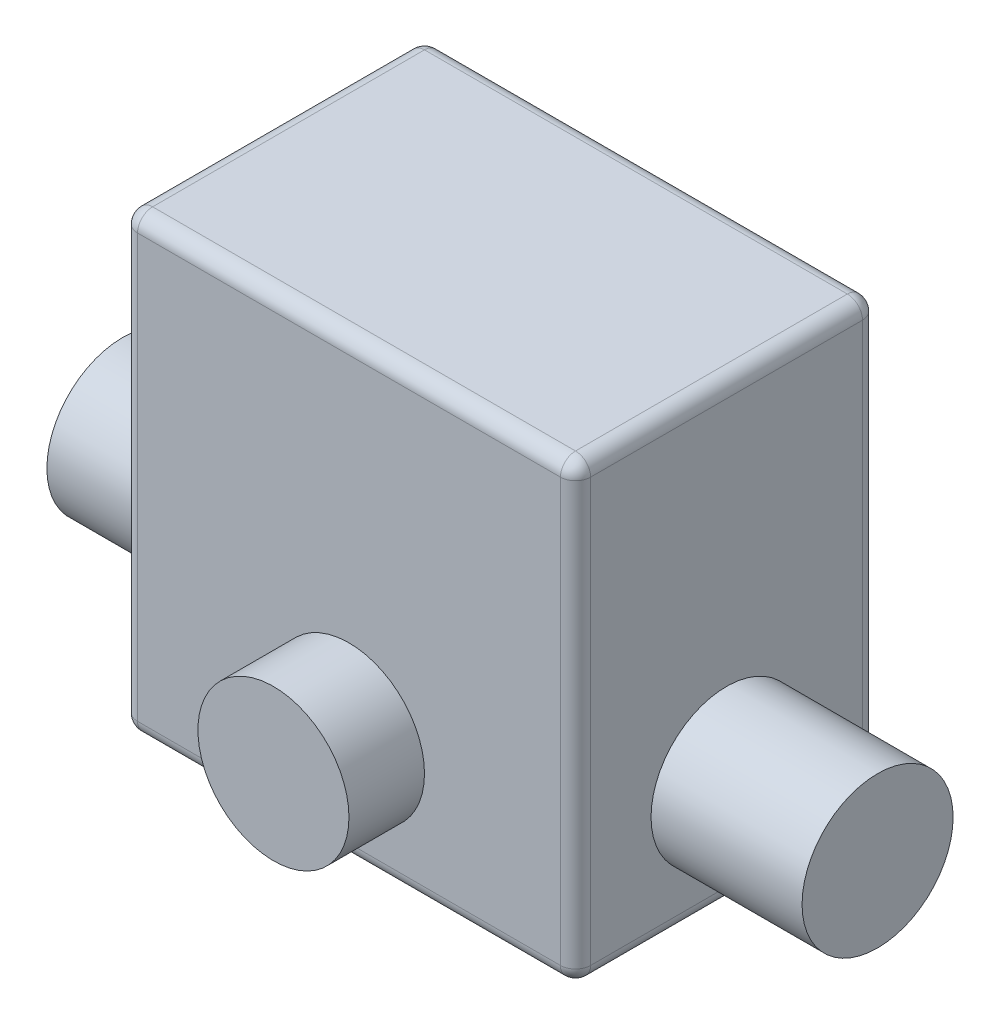
ISO-10303-21;
HEADER;
FILE_DESCRIPTION(('STEP AP214'),'2;1');
FILE_NAME('part.step','',(''),(''),'','','');
FILE_SCHEMA(('AUTOMOTIVE_DESIGN { 1 0 10303 214 1 1 1 1 }'));
ENDSEC;
DATA;
#1=APPLICATION_CONTEXT('core data for automotive mechanical design processes');
#2=APPLICATION_PROTOCOL_DEFINITION('international standard','automotive_design',2000,#1);
#3=PRODUCT_CONTEXT('',#1,'mechanical');
#4=PRODUCT('Part','Part','',(#3));
#5=PRODUCT_RELATED_PRODUCT_CATEGORY('part','',(#4));
#6=PRODUCT_DEFINITION_FORMATION('','',#4);
#7=PRODUCT_DEFINITION_CONTEXT('part definition',#1,'design');
#8=PRODUCT_DEFINITION('design','',#6,#7);
#9=PRODUCT_DEFINITION_SHAPE('','',#8);
#10=(LENGTH_UNIT() NAMED_UNIT(*) SI_UNIT(.MILLI.,.METRE.));
#11=(NAMED_UNIT(*) PLANE_ANGLE_UNIT() SI_UNIT($,.RADIAN.));
#12=(NAMED_UNIT(*) SI_UNIT($,.STERADIAN.) SOLID_ANGLE_UNIT());
#13=UNCERTAINTY_MEASURE_WITH_UNIT(LENGTH_MEASURE(1.E-05),#10,'distance_accuracy_value','');
#14=(GEOMETRIC_REPRESENTATION_CONTEXT(3) GLOBAL_UNCERTAINTY_ASSIGNED_CONTEXT((#13)) GLOBAL_UNIT_ASSIGNED_CONTEXT((#10,
#11,#12)) REPRESENTATION_CONTEXT('',''));
#15=CARTESIAN_POINT('',(0.,0.,0.));
#16=DIRECTION('',(0.,0.,1.));
#17=DIRECTION('',(1.,0.,0.));
#18=AXIS2_PLACEMENT_3D('',#15,#16,#17);
#19=CARTESIAN_POINT('',(0.,0.,2.));
#20=DIRECTION('',(0.,0.,1.));
#21=DIRECTION('',(1.,0.,0.));
#22=AXIS2_PLACEMENT_3D('',#19,#20,#21);
#23=PLANE('',#22);
#24=DIRECTION('',(0.,1.,0.));
#25=VECTOR('',#24,1.);
#26=CARTESIAN_POINT('',(2.9,3.,2.));
#27=LINE('',#26,#25);
#28=CARTESIAN_POINT('',(2.9,0.1,2.));
#29=VERTEX_POINT('',#28);
#30=CARTESIAN_POINT('',(2.9,2.9,2.));
#31=VERTEX_POINT('',#30);
#32=EDGE_CURVE('E236',#29,#31,#27,.T.);
#33=ORIENTED_EDGE('',*,*,#32,.T.);
#34=DIRECTION('',(1.,0.,0.));
#35=VECTOR('',#34,1.);
#36=CARTESIAN_POINT('',(0.,2.9,2.));
#37=LINE('',#36,#35);
#38=CARTESIAN_POINT('',(0.1,2.9,2.));
#39=VERTEX_POINT('',#38);
#40=EDGE_CURVE('E239',#31,#39,#37,.F.);
#41=ORIENTED_EDGE('',*,*,#40,.T.);
#42=DIRECTION('',(0.,1.,0.));
#43=VECTOR('',#42,1.);
#44=CARTESIAN_POINT('',(0.1,0.,2.));
#45=LINE('',#44,#43);
#46=CARTESIAN_POINT('',(0.1,0.1,2.));
#47=VERTEX_POINT('',#46);
#48=EDGE_CURVE('E234',#39,#47,#45,.F.);
#49=ORIENTED_EDGE('',*,*,#48,.T.);
#50=DIRECTION('',(1.,0.,0.));
#51=VECTOR('',#50,1.);
#52=CARTESIAN_POINT('',(3.,0.1,2.));
#53=LINE('',#52,#51);
#54=EDGE_CURVE('E232',#47,#29,#53,.T.);
#55=ORIENTED_EDGE('',*,*,#54,.T.);
#56=EDGE_LOOP('',(#33,#41,#49,#55));
#57=FACE_BOUND('',#56,.T.);
#58=CARTESIAN_POINT('',(1.5,0.75,2.));
#59=DIRECTION('',(0.,0.,1.));
#60=DIRECTION('',(1.,0.,0.));
#61=AXIS2_PLACEMENT_3D('',#58,#59,#60);
#62=CIRCLE('',#61,0.5);
#63=CARTESIAN_POINT('',(2.,0.75,2.));
#64=VERTEX_POINT('',#63);
#65=EDGE_CURVE('E616',#64,#64,#62,.T.);
#66=ORIENTED_EDGE('',*,*,#65,.F.);
#67=EDGE_LOOP('',(#66));
#68=FACE_BOUND('',#67,.T.);
#69=ADVANCED_FACE('F35',(#57,#68),#23,.T.);
#70=CARTESIAN_POINT('',(3.,0.,2.));
#71=DIRECTION('',(-1.,0.,0.));
#72=DIRECTION('',(0.,0.,1.));
#73=AXIS2_PLACEMENT_3D('',#70,#71,#72);
#74=PLANE('',#73);
#75=DIRECTION('',(0.,1.,0.));
#76=VECTOR('',#75,1.);
#77=CARTESIAN_POINT('',(3.,0.,0.1));
#78=LINE('',#77,#76);
#79=CARTESIAN_POINT('',(3.,0.1,0.1));
#80=VERTEX_POINT('',#79);
#81=CARTESIAN_POINT('',(3.,2.9,0.1));
#82=VERTEX_POINT('',#81);
#83=EDGE_CURVE('E225',#80,#82,#78,.T.);
#84=ORIENTED_EDGE('',*,*,#83,.T.);
#85=DIRECTION('',(0.,0.,-1.));
#86=VECTOR('',#85,1.);
#87=CARTESIAN_POINT('',(3.,2.9,2.));
#88=LINE('',#87,#86);
#89=CARTESIAN_POINT('',(3.,2.9,1.9));
#90=VERTEX_POINT('',#89);
#91=EDGE_CURVE('E229',#82,#90,#88,.F.);
#92=ORIENTED_EDGE('',*,*,#91,.T.);
#93=DIRECTION('',(0.,1.,0.));
#94=VECTOR('',#93,1.);
#95=CARTESIAN_POINT('',(3.,0.,1.9));
#96=LINE('',#95,#94);
#97=CARTESIAN_POINT('',(3.,0.1,1.9));
#98=VERTEX_POINT('',#97);
#99=EDGE_CURVE('E227',#90,#98,#96,.F.);
#100=ORIENTED_EDGE('',*,*,#99,.T.);
#101=DIRECTION('',(0.,0.,-1.));
#102=VECTOR('',#101,1.);
#103=CARTESIAN_POINT('',(3.,0.1,2.));
#104=LINE('',#103,#102);
#105=EDGE_CURVE('E223',#98,#80,#104,.T.);
#106=ORIENTED_EDGE('',*,*,#105,.T.);
#107=EDGE_LOOP('',(#84,#92,#100,#106));
#108=FACE_BOUND('',#107,.T.);
#109=CARTESIAN_POINT('',(3.,0.75,1.));
#110=DIRECTION('',(-1.,0.,0.));
#111=DIRECTION('',(0.,0.,1.));
#112=AXIS2_PLACEMENT_3D('',#109,#110,#111);
#113=CIRCLE('',#112,0.5);
#114=CARTESIAN_POINT('',(3.,0.75,1.5));
#115=VERTEX_POINT('',#114);
#116=EDGE_CURVE('E148',#115,#115,#113,.F.);
#117=ORIENTED_EDGE('',*,*,#116,.F.);
#118=EDGE_LOOP('',(#117));
#119=FACE_BOUND('',#118,.T.);
#120=ADVANCED_FACE('F290',(#108,#119),#74,.F.);
#121=CARTESIAN_POINT('',(0.,0.,2.));
#122=DIRECTION('',(-1.,0.,0.));
#123=DIRECTION('',(0.,0.,1.));
#124=AXIS2_PLACEMENT_3D('',#121,#122,#123);
#125=PLANE('',#124);
#126=DIRECTION('',(0.,0.,-1.));
#127=VECTOR('',#126,1.);
#128=CARTESIAN_POINT('',(0.,0.1,2.));
#129=LINE('',#128,#127);
#130=CARTESIAN_POINT('',(0.,0.1,0.1));
#131=VERTEX_POINT('',#130);
#132=CARTESIAN_POINT('',(0.,0.1,1.9));
#133=VERTEX_POINT('',#132);
#134=EDGE_CURVE('E241',#131,#133,#129,.F.);
#135=ORIENTED_EDGE('',*,*,#134,.T.);
#136=DIRECTION('',(0.,1.,0.));
#137=VECTOR('',#136,1.);
#138=CARTESIAN_POINT('',(0.,0.,1.9));
#139=LINE('',#138,#137);
#140=CARTESIAN_POINT('',(0.,2.9,1.9));
#141=VERTEX_POINT('',#140);
#142=EDGE_CURVE('E247',#133,#141,#139,.T.);
#143=ORIENTED_EDGE('',*,*,#142,.T.);
#144=DIRECTION('',(0.,0.,-1.));
#145=VECTOR('',#144,1.);
#146=CARTESIAN_POINT('',(0.,2.9,2.));
#147=LINE('',#146,#145);
#148=CARTESIAN_POINT('',(0.,2.9,0.1));
#149=VERTEX_POINT('',#148);
#150=EDGE_CURVE('E245',#141,#149,#147,.T.);
#151=ORIENTED_EDGE('',*,*,#150,.T.);
#152=DIRECTION('',(0.,1.,0.));
#153=VECTOR('',#152,1.);
#154=CARTESIAN_POINT('',(0.,0.,0.1));
#155=LINE('',#154,#153);
#156=EDGE_CURVE('E243',#149,#131,#155,.F.);
#157=ORIENTED_EDGE('',*,*,#156,.T.);
#158=EDGE_LOOP('',(#135,#143,#151,#157));
#159=FACE_BOUND('',#158,.T.);
#160=CARTESIAN_POINT('',(0.,0.75,1.));
#161=DIRECTION('',(-1.,0.,0.));
#162=DIRECTION('',(0.,0.,1.));
#163=AXIS2_PLACEMENT_3D('',#160,#161,#162);
#164=CIRCLE('',#163,0.5);
#165=CARTESIAN_POINT('',(0.,0.75,1.5));
#166=VERTEX_POINT('',#165);
#167=EDGE_CURVE('E213',#166,#166,#164,.F.);
#168=ORIENTED_EDGE('',*,*,#167,.T.);
#169=EDGE_LOOP('',(#168));
#170=FACE_BOUND('',#169,.T.);
#171=ADVANCED_FACE('F312',(#159,#170),#125,.T.);
#172=CARTESIAN_POINT('',(0.,0.,2.));
#173=DIRECTION('',(0.,1.,0.));
#174=DIRECTION('',(0.,0.,1.));
#175=AXIS2_PLACEMENT_3D('',#172,#173,#174);
#176=PLANE('',#175);
#177=DIRECTION('',(0.,0.,-1.));
#178=VECTOR('',#177,1.);
#179=CARTESIAN_POINT('',(2.9,0.,2.));
#180=LINE('',#179,#178);
#181=CARTESIAN_POINT('',(2.9,0.,0.1));
#182=VERTEX_POINT('',#181);
#183=CARTESIAN_POINT('',(2.9,0.,1.9));
#184=VERTEX_POINT('',#183);
#185=EDGE_CURVE('E258',#182,#184,#180,.F.);
#186=ORIENTED_EDGE('',*,*,#185,.T.);
#187=DIRECTION('',(1.,0.,0.));
#188=VECTOR('',#187,1.);
#189=CARTESIAN_POINT('',(0.,0.,1.9));
#190=LINE('',#189,#188);
#191=CARTESIAN_POINT('',(0.1,0.,1.9));
#192=VERTEX_POINT('',#191);
#193=EDGE_CURVE('E11',#184,#192,#190,.F.);
#194=ORIENTED_EDGE('',*,*,#193,.T.);
#195=DIRECTION('',(0.,0.,-1.));
#196=VECTOR('',#195,1.);
#197=CARTESIAN_POINT('',(0.1,0.,0.));
#198=LINE('',#197,#196);
#199=CARTESIAN_POINT('',(0.1,0.,0.1));
#200=VERTEX_POINT('',#199);
#201=EDGE_CURVE('E44',#192,#200,#198,.T.);
#202=ORIENTED_EDGE('',*,*,#201,.T.);
#203=DIRECTION('',(1.,0.,0.));
#204=VECTOR('',#203,1.);
#205=CARTESIAN_POINT('',(0.,0.,0.1));
#206=LINE('',#205,#204);
#207=EDGE_CURVE('E260',#200,#182,#206,.T.);
#208=ORIENTED_EDGE('',*,*,#207,.T.);
#209=EDGE_LOOP('',(#186,#194,#202,#208));
#210=FACE_BOUND('',#209,.T.);
#211=ADVANCED_FACE('F366',(#210),#176,.F.);
#212=CARTESIAN_POINT('',(0.,3.,2.));
#213=DIRECTION('',(0.,1.,0.));
#214=DIRECTION('',(0.,0.,1.));
#215=AXIS2_PLACEMENT_3D('',#212,#213,#214);
#216=PLANE('',#215);
#217=DIRECTION('',(1.,0.,0.));
#218=VECTOR('',#217,1.);
#219=CARTESIAN_POINT('',(0.,3.,1.9));
#220=LINE('',#219,#218);
#221=CARTESIAN_POINT('',(0.1,3.,1.9));
#222=VERTEX_POINT('',#221);
#223=CARTESIAN_POINT('',(2.9,3.,1.9));
#224=VERTEX_POINT('',#223);
#225=EDGE_CURVE('E137',#222,#224,#220,.T.);
#226=ORIENTED_EDGE('',*,*,#225,.T.);
#227=DIRECTION('',(0.,0.,-1.));
#228=VECTOR('',#227,1.);
#229=CARTESIAN_POINT('',(2.9,3.,0.));
#230=LINE('',#229,#228);
#231=CARTESIAN_POINT('',(2.9,3.,0.1));
#232=VERTEX_POINT('',#231);
#233=EDGE_CURVE('E133',#224,#232,#230,.T.);
#234=ORIENTED_EDGE('',*,*,#233,.T.);
#235=DIRECTION('',(1.,0.,0.));
#236=VECTOR('',#235,1.);
#237=CARTESIAN_POINT('',(0.,3.,0.1));
#238=LINE('',#237,#236);
#239=CARTESIAN_POINT('',(0.1,3.,0.1));
#240=VERTEX_POINT('',#239);
#241=EDGE_CURVE('E127',#232,#240,#238,.F.);
#242=ORIENTED_EDGE('',*,*,#241,.T.);
#243=DIRECTION('',(0.,0.,-1.));
#244=VECTOR('',#243,1.);
#245=CARTESIAN_POINT('',(0.1,3.,2.));
#246=LINE('',#245,#244);
#247=EDGE_CURVE('E130',#240,#222,#246,.F.);
#248=ORIENTED_EDGE('',*,*,#247,.T.);
#249=EDGE_LOOP('',(#226,#234,#242,#248));
#250=FACE_BOUND('',#249,.T.);
#251=ADVANCED_FACE('F129',(#250),#216,.T.);
#252=CARTESIAN_POINT('',(0.,0.,0.));
#253=DIRECTION('',(0.,0.,1.));
#254=DIRECTION('',(1.,0.,0.));
#255=AXIS2_PLACEMENT_3D('',#252,#253,#254);
#256=PLANE('',#255);
#257=DIRECTION('',(1.,0.,0.));
#258=VECTOR('',#257,1.);
#259=CARTESIAN_POINT('',(3.,2.9,0.));
#260=LINE('',#259,#258);
#261=CARTESIAN_POINT('',(0.1,2.9,0.));
#262=VERTEX_POINT('',#261);
#263=CARTESIAN_POINT('',(2.9,2.9,0.));
#264=VERTEX_POINT('',#263);
#265=EDGE_CURVE('E159',#262,#264,#260,.T.);
#266=ORIENTED_EDGE('',*,*,#265,.T.);
#267=DIRECTION('',(0.,1.,0.));
#268=VECTOR('',#267,1.);
#269=CARTESIAN_POINT('',(2.9,0.,0.));
#270=LINE('',#269,#268);
#271=CARTESIAN_POINT('',(2.9,0.1,0.));
#272=VERTEX_POINT('',#271);
#273=EDGE_CURVE('E255',#264,#272,#270,.F.);
#274=ORIENTED_EDGE('',*,*,#273,.T.);
#275=DIRECTION('',(1.,0.,0.));
#276=VECTOR('',#275,1.);
#277=CARTESIAN_POINT('',(0.,0.1,0.));
#278=LINE('',#277,#276);
#279=CARTESIAN_POINT('',(0.1,0.1,0.));
#280=VERTEX_POINT('',#279);
#281=EDGE_CURVE('E250',#272,#280,#278,.F.);
#282=ORIENTED_EDGE('',*,*,#281,.T.);
#283=DIRECTION('',(0.,1.,0.));
#284=VECTOR('',#283,1.);
#285=CARTESIAN_POINT('',(0.1,3.,0.));
#286=LINE('',#285,#284);
#287=EDGE_CURVE('E252',#280,#262,#286,.T.);
#288=ORIENTED_EDGE('',*,*,#287,.T.);
#289=EDGE_LOOP('',(#266,#274,#282,#288));
#290=FACE_BOUND('',#289,.T.);
#291=ADVANCED_FACE('F304',(#290),#256,.F.);
#292=CARTESIAN_POINT('',(-1.,0.75,1.));
#293=DIRECTION('',(1.,0.,0.));
#294=DIRECTION('',(0.,0.,-1.));
#295=AXIS2_PLACEMENT_3D('',#292,#293,#294);
#296=PLANE('',#295);
#297=CARTESIAN_POINT('',(-1.,0.75,1.));
#298=DIRECTION('',(1.,0.,0.));
#299=DIRECTION('',(0.,0.,-1.));
#300=AXIS2_PLACEMENT_3D('',#297,#298,#299);
#301=CIRCLE('',#300,0.5);
#302=CARTESIAN_POINT('',(-1.,0.75,0.5));
#303=VERTEX_POINT('',#302);
#304=EDGE_CURVE('E203',#303,#303,#301,.T.);
#305=ORIENTED_EDGE('',*,*,#304,.F.);
#306=EDGE_LOOP('',(#305));
#307=FACE_BOUND('',#306,.T.);
#308=ADVANCED_FACE('F363',(#307),#296,.F.);
#309=CARTESIAN_POINT('',(4.,0.75,1.));
#310=DIRECTION('',(-1.,0.,0.));
#311=DIRECTION('',(0.,0.,1.));
#312=AXIS2_PLACEMENT_3D('',#309,#310,#311);
#313=CYLINDRICAL_SURFACE('',#312,0.5);
#314=ORIENTED_EDGE('',*,*,#167,.F.);
#315=EDGE_LOOP('',(#314));
#316=FACE_BOUND('',#315,.T.);
#317=ORIENTED_EDGE('',*,*,#304,.T.);
#318=EDGE_LOOP('',(#317));
#319=FACE_BOUND('',#318,.T.);
#320=ADVANCED_FACE('F359',(#316,#319),#313,.T.);
#321=CARTESIAN_POINT('',(4.,0.75,1.));
#322=DIRECTION('',(1.,0.,0.));
#323=DIRECTION('',(0.,0.,-1.));
#324=AXIS2_PLACEMENT_3D('',#321,#322,#323);
#325=CIRCLE('',#324,0.5);
#326=CARTESIAN_POINT('',(4.,0.75,0.5));
#327=VERTEX_POINT('',#326);
#328=EDGE_CURVE('E208',#327,#327,#325,.T.);
#329=ORIENTED_EDGE('',*,*,#328,.F.);
#330=EDGE_LOOP('',(#329));
#331=FACE_BOUND('',#330,.T.);
#332=ORIENTED_EDGE('',*,*,#116,.T.);
#333=EDGE_LOOP('',(#332));
#334=FACE_BOUND('',#333,.T.);
#335=ADVANCED_FACE('F551',(#331,#334),#313,.T.);
#336=CARTESIAN_POINT('',(4.,0.75,1.));
#337=DIRECTION('',(1.,0.,0.));
#338=DIRECTION('',(0.,0.,-1.));
#339=AXIS2_PLACEMENT_3D('',#336,#337,#338);
#340=PLANE('',#339);
#341=ORIENTED_EDGE('',*,*,#328,.T.);
#342=EDGE_LOOP('',(#341));
#343=FACE_BOUND('',#342,.T.);
#344=ADVANCED_FACE('F543',(#343),#340,.T.);
#345=CARTESIAN_POINT('',(0.1,0.1,2.));
#346=DIRECTION('',(0.,0.,1.));
#347=DIRECTION('',(1.,0.,0.));
#348=AXIS2_PLACEMENT_3D('',#345,#346,#347);
#349=CYLINDRICAL_SURFACE('',#348,0.1);
#350=CARTESIAN_POINT('',(0.1,0.1,1.9));
#351=DIRECTION('',(0.,0.,1.));
#352=DIRECTION('',(1.,0.,0.));
#353=AXIS2_PLACEMENT_3D('',#350,#351,#352);
#354=CIRCLE('',#353,0.1);
#355=EDGE_CURVE('E39',#133,#192,#354,.T.);
#356=ORIENTED_EDGE('',*,*,#355,.F.);
#357=ORIENTED_EDGE('',*,*,#134,.F.);
#358=CARTESIAN_POINT('',(0.1,0.1,0.1));
#359=DIRECTION('',(0.,0.,-1.));
#360=DIRECTION('',(-1.,0.,0.));
#361=AXIS2_PLACEMENT_3D('',#358,#359,#360);
#362=CIRCLE('',#361,0.1);
#363=EDGE_CURVE('E198',#200,#131,#362,.T.);
#364=ORIENTED_EDGE('',*,*,#363,.F.);
#365=ORIENTED_EDGE('',*,*,#201,.F.);
#366=EDGE_LOOP('',(#356,#357,#364,#365));
#367=FACE_BOUND('',#366,.T.);
#368=ADVANCED_FACE('F37',(#367),#349,.T.);
#369=CARTESIAN_POINT('',(0.1,0.1,1.9));
#370=DIRECTION('',(0.,0.,1.));
#371=DIRECTION('',(1.,0.,0.));
#372=AXIS2_PLACEMENT_3D('',#369,#370,#371);
#373=SPHERICAL_SURFACE('',#372,0.1);
#374=CARTESIAN_POINT('',(0.1,0.1,1.9));
#375=DIRECTION('',(0.,-1.,0.));
#376=DIRECTION('',(0.,0.,-1.));
#377=AXIS2_PLACEMENT_3D('',#374,#375,#376);
#378=CIRCLE('',#377,0.1);
#379=EDGE_CURVE('E195',#133,#47,#378,.F.);
#380=ORIENTED_EDGE('',*,*,#379,.F.);
#381=ORIENTED_EDGE('',*,*,#355,.T.);
#382=CARTESIAN_POINT('',(0.1,0.1,1.9));
#383=DIRECTION('',(-1.,0.,0.));
#384=DIRECTION('',(0.,0.,1.));
#385=AXIS2_PLACEMENT_3D('',#382,#383,#384);
#386=CIRCLE('',#385,0.1);
#387=EDGE_CURVE('E52',#47,#192,#386,.F.);
#388=ORIENTED_EDGE('',*,*,#387,.F.);
#389=EDGE_LOOP('',(#380,#381,#388));
#390=FACE_BOUND('',#389,.T.);
#391=ADVANCED_FACE('F316',(#390),#373,.T.);
#392=CARTESIAN_POINT('',(0.1,0.1,0.1));
#393=DIRECTION('',(0.,0.,1.));
#394=DIRECTION('',(1.,0.,0.));
#395=AXIS2_PLACEMENT_3D('',#392,#393,#394);
#396=SPHERICAL_SURFACE('',#395,0.1);
#397=CARTESIAN_POINT('',(0.1,0.1,0.1));
#398=DIRECTION('',(-1.,0.,0.));
#399=DIRECTION('',(0.,0.,1.));
#400=AXIS2_PLACEMENT_3D('',#397,#398,#399);
#401=CIRCLE('',#400,0.1);
#402=EDGE_CURVE('E189',#200,#280,#401,.F.);
#403=ORIENTED_EDGE('',*,*,#402,.F.);
#404=ORIENTED_EDGE('',*,*,#363,.T.);
#405=CARTESIAN_POINT('',(0.1,0.1,0.1));
#406=DIRECTION('',(0.,-1.,0.));
#407=DIRECTION('',(0.,0.,-1.));
#408=AXIS2_PLACEMENT_3D('',#405,#406,#407);
#409=CIRCLE('',#408,0.1);
#410=EDGE_CURVE('E192',#280,#131,#409,.F.);
#411=ORIENTED_EDGE('',*,*,#410,.F.);
#412=EDGE_LOOP('',(#403,#404,#411));
#413=FACE_BOUND('',#412,.T.);
#414=ADVANCED_FACE('F343',(#413),#396,.T.);
#415=CARTESIAN_POINT('',(0.,0.1,1.9));
#416=DIRECTION('',(-1.,0.,0.));
#417=DIRECTION('',(0.,0.,1.));
#418=AXIS2_PLACEMENT_3D('',#415,#416,#417);
#419=CYLINDRICAL_SURFACE('',#418,0.1);
#420=ORIENTED_EDGE('',*,*,#387,.T.);
#421=ORIENTED_EDGE('',*,*,#193,.F.);
#422=CARTESIAN_POINT('',(2.9,0.1,1.9));
#423=DIRECTION('',(1.,0.,0.));
#424=DIRECTION('',(0.,0.,-1.));
#425=AXIS2_PLACEMENT_3D('',#422,#423,#424);
#426=CIRCLE('',#425,0.1);
#427=EDGE_CURVE('E183',#29,#184,#426,.T.);
#428=ORIENTED_EDGE('',*,*,#427,.F.);
#429=ORIENTED_EDGE('',*,*,#54,.F.);
#430=EDGE_LOOP('',(#420,#421,#428,#429));
#431=FACE_BOUND('',#430,.T.);
#432=ADVANCED_FACE('F329',(#431),#419,.T.);
#433=CARTESIAN_POINT('',(0.1,0.,1.9));
#434=DIRECTION('',(0.,1.,0.));
#435=DIRECTION('',(0.,0.,1.));
#436=AXIS2_PLACEMENT_3D('',#433,#434,#435);
#437=CYLINDRICAL_SURFACE('',#436,0.1);
#438=ORIENTED_EDGE('',*,*,#379,.T.);
#439=ORIENTED_EDGE('',*,*,#48,.F.);
#440=CARTESIAN_POINT('',(0.1,2.9,1.9));
#441=DIRECTION('',(0.,1.,0.));
#442=DIRECTION('',(0.,0.,1.));
#443=AXIS2_PLACEMENT_3D('',#440,#441,#442);
#444=CIRCLE('',#443,0.1);
#445=EDGE_CURVE('E180',#141,#39,#444,.T.);
#446=ORIENTED_EDGE('',*,*,#445,.F.);
#447=ORIENTED_EDGE('',*,*,#142,.F.);
#448=EDGE_LOOP('',(#438,#439,#446,#447));
#449=FACE_BOUND('',#448,.T.);
#450=ADVANCED_FACE('F320',(#449),#437,.T.);
#451=CARTESIAN_POINT('',(0.1,2.9,2.));
#452=DIRECTION('',(0.,0.,-1.));
#453=DIRECTION('',(-1.,0.,0.));
#454=AXIS2_PLACEMENT_3D('',#451,#452,#453);
#455=CYLINDRICAL_SURFACE('',#454,0.1);
#456=CARTESIAN_POINT('',(0.1,2.9,0.1));
#457=DIRECTION('',(0.,0.,-1.));
#458=DIRECTION('',(-1.,0.,0.));
#459=AXIS2_PLACEMENT_3D('',#456,#457,#458);
#460=CIRCLE('',#459,0.1);
#461=EDGE_CURVE('E144',#149,#240,#460,.T.);
#462=ORIENTED_EDGE('',*,*,#461,.F.);
#463=ORIENTED_EDGE('',*,*,#150,.F.);
#464=CARTESIAN_POINT('',(0.1,2.9,1.9));
#465=DIRECTION('',(0.,0.,1.));
#466=DIRECTION('',(1.,0.,0.));
#467=AXIS2_PLACEMENT_3D('',#464,#465,#466);
#468=CIRCLE('',#467,0.1);
#469=EDGE_CURVE('E146',#222,#141,#468,.T.);
#470=ORIENTED_EDGE('',*,*,#469,.F.);
#471=ORIENTED_EDGE('',*,*,#247,.F.);
#472=EDGE_LOOP('',(#462,#463,#470,#471));
#473=FACE_BOUND('',#472,.T.);
#474=ADVANCED_FACE('F142',(#473),#455,.T.);
#475=CARTESIAN_POINT('',(0.1,0.,0.1));
#476=DIRECTION('',(0.,-1.,0.));
#477=DIRECTION('',(0.,0.,-1.));
#478=AXIS2_PLACEMENT_3D('',#475,#476,#477);
#479=CYLINDRICAL_SURFACE('',#478,0.1);
#480=ORIENTED_EDGE('',*,*,#410,.T.);
#481=ORIENTED_EDGE('',*,*,#156,.F.);
#482=CARTESIAN_POINT('',(0.1,2.9,0.1));
#483=DIRECTION('',(0.,1.,0.));
#484=DIRECTION('',(0.,0.,1.));
#485=AXIS2_PLACEMENT_3D('',#482,#483,#484);
#486=CIRCLE('',#485,0.1);
#487=EDGE_CURVE('E156',#262,#149,#486,.T.);
#488=ORIENTED_EDGE('',*,*,#487,.F.);
#489=ORIENTED_EDGE('',*,*,#287,.F.);
#490=EDGE_LOOP('',(#480,#481,#488,#489));
#491=FACE_BOUND('',#490,.T.);
#492=ADVANCED_FACE('F309',(#491),#479,.T.);
#493=CARTESIAN_POINT('',(0.,0.1,0.1));
#494=DIRECTION('',(1.,0.,0.));
#495=DIRECTION('',(0.,0.,-1.));
#496=AXIS2_PLACEMENT_3D('',#493,#494,#495);
#497=CYLINDRICAL_SURFACE('',#496,0.1);
#498=ORIENTED_EDGE('',*,*,#402,.T.);
#499=ORIENTED_EDGE('',*,*,#281,.F.);
#500=CARTESIAN_POINT('',(2.9,0.1,0.1));
#501=DIRECTION('',(1.,0.,0.));
#502=DIRECTION('',(0.,0.,-1.));
#503=AXIS2_PLACEMENT_3D('',#500,#501,#502);
#504=CIRCLE('',#503,0.1);
#505=EDGE_CURVE('E175',#182,#272,#504,.T.);
#506=ORIENTED_EDGE('',*,*,#505,.F.);
#507=ORIENTED_EDGE('',*,*,#207,.F.);
#508=EDGE_LOOP('',(#498,#499,#506,#507));
#509=FACE_BOUND('',#508,.T.);
#510=ADVANCED_FACE('F342',(#509),#497,.T.);
#511=CARTESIAN_POINT('',(2.9,0.1,2.));
#512=DIRECTION('',(0.,0.,-1.));
#513=DIRECTION('',(-1.,0.,0.));
#514=AXIS2_PLACEMENT_3D('',#511,#512,#513);
#515=CYLINDRICAL_SURFACE('',#514,0.1);
#516=CARTESIAN_POINT('',(2.9,0.1,1.9));
#517=DIRECTION('',(0.,0.,1.));
#518=DIRECTION('',(1.,0.,0.));
#519=AXIS2_PLACEMENT_3D('',#516,#517,#518);
#520=CIRCLE('',#519,0.1);
#521=EDGE_CURVE('E186',#184,#98,#520,.T.);
#522=ORIENTED_EDGE('',*,*,#521,.F.);
#523=ORIENTED_EDGE('',*,*,#185,.F.);
#524=CARTESIAN_POINT('',(2.9,0.1,0.1));
#525=DIRECTION('',(0.,0.,-1.));
#526=DIRECTION('',(-1.,0.,0.));
#527=AXIS2_PLACEMENT_3D('',#524,#525,#526);
#528=CIRCLE('',#527,0.1);
#529=EDGE_CURVE('E172',#80,#182,#528,.T.);
#530=ORIENTED_EDGE('',*,*,#529,.F.);
#531=ORIENTED_EDGE('',*,*,#105,.F.);
#532=EDGE_LOOP('',(#522,#523,#530,#531));
#533=FACE_BOUND('',#532,.T.);
#534=ADVANCED_FACE('F335',(#533),#515,.T.);
#535=CARTESIAN_POINT('',(2.9,0.1,1.9));
#536=DIRECTION('',(0.,0.,1.));
#537=DIRECTION('',(1.,0.,0.));
#538=AXIS2_PLACEMENT_3D('',#535,#536,#537);
#539=SPHERICAL_SURFACE('',#538,0.1);
#540=ORIENTED_EDGE('',*,*,#427,.T.);
#541=ORIENTED_EDGE('',*,*,#521,.T.);
#542=CARTESIAN_POINT('',(2.9,0.1,1.9));
#543=DIRECTION('',(0.,-1.,0.));
#544=DIRECTION('',(0.,0.,-1.));
#545=AXIS2_PLACEMENT_3D('',#542,#543,#544);
#546=CIRCLE('',#545,0.1);
#547=EDGE_CURVE('E164',#29,#98,#546,.F.);
#548=ORIENTED_EDGE('',*,*,#547,.F.);
#549=EDGE_LOOP('',(#540,#541,#548));
#550=FACE_BOUND('',#549,.T.);
#551=ADVANCED_FACE('F332',(#550),#539,.T.);
#552=CARTESIAN_POINT('',(0.1,2.9,1.9));
#553=DIRECTION('',(0.,0.,1.));
#554=DIRECTION('',(1.,0.,0.));
#555=AXIS2_PLACEMENT_3D('',#552,#553,#554);
#556=SPHERICAL_SURFACE('',#555,0.1);
#557=ORIENTED_EDGE('',*,*,#469,.T.);
#558=ORIENTED_EDGE('',*,*,#445,.T.);
#559=CARTESIAN_POINT('',(0.1,2.9,1.9));
#560=DIRECTION('',(-1.,0.,0.));
#561=DIRECTION('',(0.,0.,1.));
#562=AXIS2_PLACEMENT_3D('',#559,#560,#561);
#563=CIRCLE('',#562,0.1);
#564=EDGE_CURVE('E160',#222,#39,#563,.F.);
#565=ORIENTED_EDGE('',*,*,#564,.F.);
#566=EDGE_LOOP('',(#557,#558,#565));
#567=FACE_BOUND('',#566,.T.);
#568=ADVANCED_FACE('F322',(#567),#556,.T.);
#569=CARTESIAN_POINT('',(0.1,2.9,0.1));
#570=DIRECTION('',(0.,0.,1.));
#571=DIRECTION('',(1.,0.,0.));
#572=AXIS2_PLACEMENT_3D('',#569,#570,#571);
#573=SPHERICAL_SURFACE('',#572,0.1);
#574=ORIENTED_EDGE('',*,*,#487,.T.);
#575=ORIENTED_EDGE('',*,*,#461,.T.);
#576=CARTESIAN_POINT('',(0.1,2.9,0.1));
#577=DIRECTION('',(-1.,0.,0.));
#578=DIRECTION('',(0.,0.,1.));
#579=AXIS2_PLACEMENT_3D('',#576,#577,#578);
#580=CIRCLE('',#579,0.1);
#581=EDGE_CURVE('E153',#262,#240,#580,.F.);
#582=ORIENTED_EDGE('',*,*,#581,.F.);
#583=EDGE_LOOP('',(#574,#575,#582));
#584=FACE_BOUND('',#583,.T.);
#585=ADVANCED_FACE('F152',(#584),#573,.T.);
#586=CARTESIAN_POINT('',(2.9,0.1,0.1));
#587=DIRECTION('',(0.,0.,1.));
#588=DIRECTION('',(1.,0.,0.));
#589=AXIS2_PLACEMENT_3D('',#586,#587,#588);
#590=SPHERICAL_SURFACE('',#589,0.1);
#591=ORIENTED_EDGE('',*,*,#529,.T.);
#592=ORIENTED_EDGE('',*,*,#505,.T.);
#593=CARTESIAN_POINT('',(2.9,0.1,0.1));
#594=DIRECTION('',(0.,-1.,0.));
#595=DIRECTION('',(0.,0.,-1.));
#596=AXIS2_PLACEMENT_3D('',#593,#594,#595);
#597=CIRCLE('',#596,0.1);
#598=EDGE_CURVE('E161',#80,#272,#597,.F.);
#599=ORIENTED_EDGE('',*,*,#598,.F.);
#600=EDGE_LOOP('',(#591,#592,#599));
#601=FACE_BOUND('',#600,.T.);
#602=ADVANCED_FACE('F339',(#601),#590,.T.);
#603=CARTESIAN_POINT('',(2.9,0.,1.9));
#604=DIRECTION('',(0.,-1.,0.));
#605=DIRECTION('',(0.,0.,-1.));
#606=AXIS2_PLACEMENT_3D('',#603,#604,#605);
#607=CYLINDRICAL_SURFACE('',#606,0.1);
#608=ORIENTED_EDGE('',*,*,#547,.T.);
#609=ORIENTED_EDGE('',*,*,#99,.F.);
#610=CARTESIAN_POINT('',(2.9,2.9,1.9));
#611=DIRECTION('',(0.,1.,0.));
#612=DIRECTION('',(0.,0.,1.));
#613=AXIS2_PLACEMENT_3D('',#610,#611,#612);
#614=CIRCLE('',#613,0.1);
#615=EDGE_CURVE('E166',#31,#90,#614,.T.);
#616=ORIENTED_EDGE('',*,*,#615,.F.);
#617=ORIENTED_EDGE('',*,*,#32,.F.);
#618=EDGE_LOOP('',(#608,#609,#616,#617));
#619=FACE_BOUND('',#618,.T.);
#620=ADVANCED_FACE('F285',(#619),#607,.T.);
#621=CARTESIAN_POINT('',(0.,2.9,1.9));
#622=DIRECTION('',(1.,0.,0.));
#623=DIRECTION('',(0.,0.,-1.));
#624=AXIS2_PLACEMENT_3D('',#621,#622,#623);
#625=CYLINDRICAL_SURFACE('',#624,0.1);
#626=ORIENTED_EDGE('',*,*,#564,.T.);
#627=ORIENTED_EDGE('',*,*,#40,.F.);
#628=CARTESIAN_POINT('',(2.9,2.9,1.9));
#629=DIRECTION('',(1.,0.,0.));
#630=DIRECTION('',(0.,0.,-1.));
#631=AXIS2_PLACEMENT_3D('',#628,#629,#630);
#632=CIRCLE('',#631,0.1);
#633=EDGE_CURVE('E274',#224,#31,#632,.T.);
#634=ORIENTED_EDGE('',*,*,#633,.F.);
#635=ORIENTED_EDGE('',*,*,#225,.F.);
#636=EDGE_LOOP('',(#626,#627,#634,#635));
#637=FACE_BOUND('',#636,.T.);
#638=ADVANCED_FACE('F325',(#637),#625,.T.);
#639=CARTESIAN_POINT('',(0.,2.9,0.1));
#640=DIRECTION('',(-1.,0.,0.));
#641=DIRECTION('',(0.,0.,1.));
#642=AXIS2_PLACEMENT_3D('',#639,#640,#641);
#643=CYLINDRICAL_SURFACE('',#642,0.1);
#644=ORIENTED_EDGE('',*,*,#581,.T.);
#645=ORIENTED_EDGE('',*,*,#241,.F.);
#646=CARTESIAN_POINT('',(2.9,2.9,0.1));
#647=DIRECTION('',(1.,0.,0.));
#648=DIRECTION('',(0.,0.,-1.));
#649=AXIS2_PLACEMENT_3D('',#646,#647,#648);
#650=CIRCLE('',#649,0.1);
#651=EDGE_CURVE('E271',#264,#232,#650,.T.);
#652=ORIENTED_EDGE('',*,*,#651,.F.);
#653=ORIENTED_EDGE('',*,*,#265,.F.);
#654=EDGE_LOOP('',(#644,#645,#652,#653));
#655=FACE_BOUND('',#654,.T.);
#656=ADVANCED_FACE('F158',(#655),#643,.T.);
#657=CARTESIAN_POINT('',(2.9,0.,0.1));
#658=DIRECTION('',(0.,1.,0.));
#659=DIRECTION('',(0.,0.,1.));
#660=AXIS2_PLACEMENT_3D('',#657,#658,#659);
#661=CYLINDRICAL_SURFACE('',#660,0.1);
#662=ORIENTED_EDGE('',*,*,#598,.T.);
#663=ORIENTED_EDGE('',*,*,#273,.F.);
#664=CARTESIAN_POINT('',(2.9,2.9,0.1));
#665=DIRECTION('',(0.,1.,0.));
#666=DIRECTION('',(0.,0.,1.));
#667=AXIS2_PLACEMENT_3D('',#664,#665,#666);
#668=CIRCLE('',#667,0.1);
#669=EDGE_CURVE('E268',#82,#264,#668,.T.);
#670=ORIENTED_EDGE('',*,*,#669,.F.);
#671=ORIENTED_EDGE('',*,*,#83,.F.);
#672=EDGE_LOOP('',(#662,#663,#670,#671));
#673=FACE_BOUND('',#672,.T.);
#674=ADVANCED_FACE('F301',(#673),#661,.T.);
#675=CARTESIAN_POINT('',(2.9,2.9,1.9));
#676=DIRECTION('',(0.,0.,1.));
#677=DIRECTION('',(1.,0.,0.));
#678=AXIS2_PLACEMENT_3D('',#675,#676,#677);
#679=SPHERICAL_SURFACE('',#678,0.1);
#680=ORIENTED_EDGE('',*,*,#633,.T.);
#681=ORIENTED_EDGE('',*,*,#615,.T.);
#682=CARTESIAN_POINT('',(2.9,2.9,1.9));
#683=DIRECTION('',(0.,0.,1.));
#684=DIRECTION('',(1.,0.,0.));
#685=AXIS2_PLACEMENT_3D('',#682,#683,#684);
#686=CIRCLE('',#685,0.1);
#687=EDGE_CURVE('E265',#224,#90,#686,.F.);
#688=ORIENTED_EDGE('',*,*,#687,.F.);
#689=EDGE_LOOP('',(#680,#681,#688));
#690=FACE_BOUND('',#689,.T.);
#691=ADVANCED_FACE('F280',(#690),#679,.T.);
#692=CARTESIAN_POINT('',(2.9,2.9,0.1));
#693=DIRECTION('',(0.,0.,1.));
#694=DIRECTION('',(1.,0.,0.));
#695=AXIS2_PLACEMENT_3D('',#692,#693,#694);
#696=SPHERICAL_SURFACE('',#695,0.1);
#697=ORIENTED_EDGE('',*,*,#669,.T.);
#698=ORIENTED_EDGE('',*,*,#651,.T.);
#699=CARTESIAN_POINT('',(2.9,2.9,0.1));
#700=DIRECTION('',(0.,0.,-1.));
#701=DIRECTION('',(-1.,0.,0.));
#702=AXIS2_PLACEMENT_3D('',#699,#700,#701);
#703=CIRCLE('',#702,0.1);
#704=EDGE_CURVE('E263',#82,#232,#703,.F.);
#705=ORIENTED_EDGE('',*,*,#704,.F.);
#706=EDGE_LOOP('',(#697,#698,#705));
#707=FACE_BOUND('',#706,.T.);
#708=ADVANCED_FACE('F298',(#707),#696,.T.);
#709=CARTESIAN_POINT('',(2.9,2.9,2.));
#710=DIRECTION('',(0.,0.,1.));
#711=DIRECTION('',(1.,0.,0.));
#712=AXIS2_PLACEMENT_3D('',#709,#710,#711);
#713=CYLINDRICAL_SURFACE('',#712,0.1);
#714=ORIENTED_EDGE('',*,*,#687,.T.);
#715=ORIENTED_EDGE('',*,*,#91,.F.);
#716=ORIENTED_EDGE('',*,*,#704,.T.);
#717=ORIENTED_EDGE('',*,*,#233,.F.);
#718=EDGE_LOOP('',(#714,#715,#716,#717));
#719=FACE_BOUND('',#718,.T.);
#720=ADVANCED_FACE('F296',(#719),#713,.T.);
#721=CARTESIAN_POINT('',(1.5,0.75,2.5));
#722=DIRECTION('',(0.,0.,-1.));
#723=DIRECTION('',(-1.,0.,0.));
#724=AXIS2_PLACEMENT_3D('',#721,#722,#723);
#725=CYLINDRICAL_SURFACE('',#724,0.5);
#726=CARTESIAN_POINT('',(1.5,0.75,2.5));
#727=DIRECTION('',(0.,0.,1.));
#728=DIRECTION('',(1.,0.,0.));
#729=AXIS2_PLACEMENT_3D('',#726,#727,#728);
#730=CIRCLE('',#729,0.5);
#731=CARTESIAN_POINT('',(2.,0.75,2.5));
#732=VERTEX_POINT('',#731);
#733=EDGE_CURVE('E266',#732,#732,#730,.T.);
#734=ORIENTED_EDGE('',*,*,#733,.F.);
#735=EDGE_LOOP('',(#734));
#736=FACE_BOUND('',#735,.T.);
#737=ORIENTED_EDGE('',*,*,#65,.T.);
#738=EDGE_LOOP('',(#737));
#739=FACE_BOUND('',#738,.T.);
#740=ADVANCED_FACE('F373',(#736,#739),#725,.T.);
#741=CARTESIAN_POINT('',(1.5,0.75,2.5));
#742=DIRECTION('',(0.,0.,1.));
#743=DIRECTION('',(1.,0.,0.));
#744=AXIS2_PLACEMENT_3D('',#741,#742,#743);
#745=PLANE('',#744);
#746=ORIENTED_EDGE('',*,*,#733,.T.);
#747=EDGE_LOOP('',(#746));
#748=FACE_BOUND('',#747,.T.);
#749=ADVANCED_FACE('F473',(#748),#745,.T.);
#750=CLOSED_SHELL('',(#69,#120,#171,#211,#251,#291,#308,#320,#335,#344,#368,#391,#414,#432,#450,
#474,#492,#510,#534,#551,#568,#585,#602,#620,#638,#656,#674,#691,#708,#720,#740,#749));
#751=MANIFOLD_SOLID_BREP('B2',#750);
#752=ADVANCED_BREP_SHAPE_REPRESENTATION('',(#18,#751),#14);
#753=SHAPE_DEFINITION_REPRESENTATION(#9,#752);
ENDSEC;
END-ISO-10303-21;
